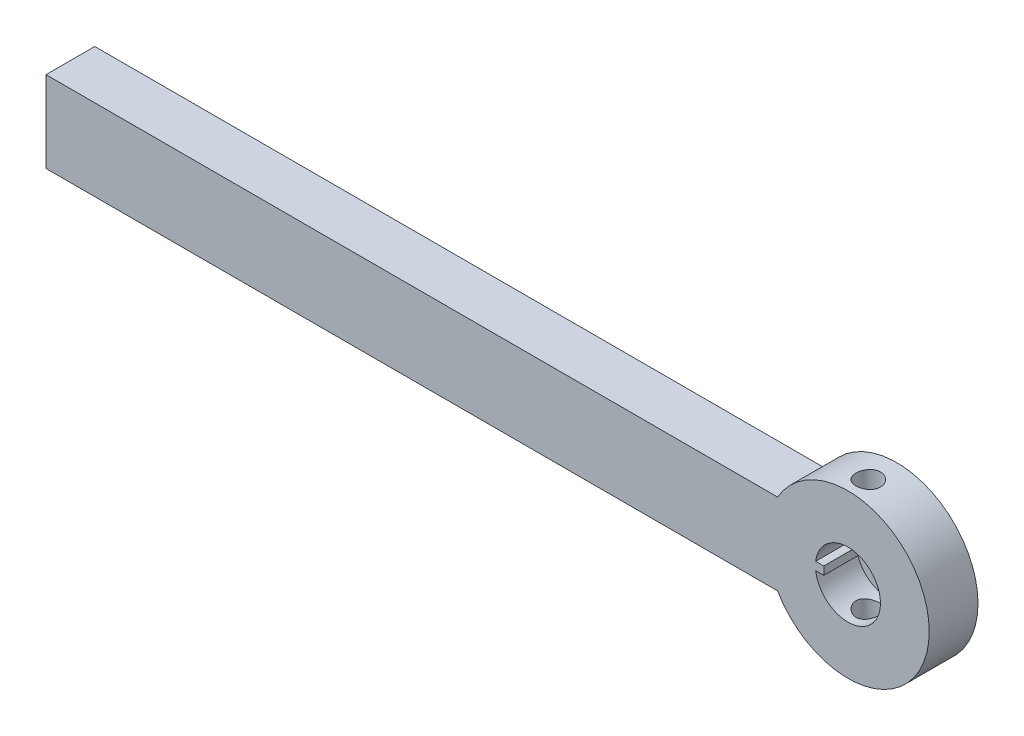
ISO-10303-21;
HEADER;
FILE_DESCRIPTION(('STEP AP214'),'2;1');
FILE_NAME('part.step','',(''),(''),'','','');
FILE_SCHEMA(('AUTOMOTIVE_DESIGN { 1 0 10303 214 1 1 1 1 }'));
ENDSEC;
DATA;
#1=APPLICATION_CONTEXT('core data for automotive mechanical design processes');
#2=APPLICATION_PROTOCOL_DEFINITION('international standard','automotive_design',2000,#1);
#3=PRODUCT_CONTEXT('',#1,'mechanical');
#4=PRODUCT('Part','Part','',(#3));
#5=PRODUCT_RELATED_PRODUCT_CATEGORY('part','',(#4));
#6=PRODUCT_DEFINITION_FORMATION('','',#4);
#7=PRODUCT_DEFINITION_CONTEXT('part definition',#1,'design');
#8=PRODUCT_DEFINITION('design','',#6,#7);
#9=PRODUCT_DEFINITION_SHAPE('','',#8);
#10=(LENGTH_UNIT() NAMED_UNIT(*) SI_UNIT(.MILLI.,.METRE.));
#11=(NAMED_UNIT(*) PLANE_ANGLE_UNIT() SI_UNIT($,.RADIAN.));
#12=(NAMED_UNIT(*) SI_UNIT($,.STERADIAN.) SOLID_ANGLE_UNIT());
#13=UNCERTAINTY_MEASURE_WITH_UNIT(LENGTH_MEASURE(1.E-05),#10,'distance_accuracy_value','');
#14=(GEOMETRIC_REPRESENTATION_CONTEXT(3) GLOBAL_UNCERTAINTY_ASSIGNED_CONTEXT((#13)) GLOBAL_UNIT_ASSIGNED_CONTEXT((#10,
#11,#12)) REPRESENTATION_CONTEXT('',''));
#15=CARTESIAN_POINT('',(0.,0.,0.));
#16=DIRECTION('',(0.,0.,1.));
#17=DIRECTION('',(1.,0.,0.));
#18=AXIS2_PLACEMENT_3D('',#15,#16,#17);
#19=CARTESIAN_POINT('',(-98.6602540378444,5.,6.));
#20=DIRECTION('',(1.,0.,0.));
#21=DIRECTION('',(0.,0.,-1.));
#22=AXIS2_PLACEMENT_3D('',#19,#20,#21);
#23=PLANE('',#22);
#24=DIRECTION('',(0.,-1.,0.));
#25=VECTOR('',#24,1.);
#26=CARTESIAN_POINT('',(-98.6602540378444,5.,0.));
#27=LINE('',#26,#25);
#28=CARTESIAN_POINT('',(-98.6602540378444,5.,0.));
#29=VERTEX_POINT('',#28);
#30=CARTESIAN_POINT('',(-98.6602540378444,-5.,0.));
#31=VERTEX_POINT('',#30);
#32=EDGE_CURVE('E198',#29,#31,#27,.T.);
#33=ORIENTED_EDGE('',*,*,#32,.T.);
#34=DIRECTION('',(0.,0.,-1.));
#35=VECTOR('',#34,1.);
#36=CARTESIAN_POINT('',(-98.6602540378444,-5.,6.));
#37=LINE('',#36,#35);
#38=CARTESIAN_POINT('',(-98.6602540378444,-5.,6.));
#39=VERTEX_POINT('',#38);
#40=EDGE_CURVE('E11',#39,#31,#37,.T.);
#41=ORIENTED_EDGE('',*,*,#40,.F.);
#42=DIRECTION('',(0.,-1.,0.));
#43=VECTOR('',#42,1.);
#44=CARTESIAN_POINT('',(-98.6602540378444,5.,6.));
#45=LINE('',#44,#43);
#46=CARTESIAN_POINT('',(-98.6602540378444,5.,6.));
#47=VERTEX_POINT('',#46);
#48=EDGE_CURVE('E216',#47,#39,#45,.T.);
#49=ORIENTED_EDGE('',*,*,#48,.F.);
#50=DIRECTION('',(0.,0.,-1.));
#51=VECTOR('',#50,1.);
#52=CARTESIAN_POINT('',(-98.6602540378444,5.,6.));
#53=LINE('',#52,#51);
#54=EDGE_CURVE('E201',#47,#29,#53,.T.);
#55=ORIENTED_EDGE('',*,*,#54,.T.);
#56=EDGE_LOOP('',(#33,#41,#49,#55));
#57=FACE_BOUND('',#56,.T.);
#58=ADVANCED_FACE('F32',(#57),#23,.F.);
#59=CARTESIAN_POINT('',(-98.6602540378444,-5.,6.));
#60=DIRECTION('',(0.,1.,0.));
#61=DIRECTION('',(-1.,0.,0.));
#62=AXIS2_PLACEMENT_3D('',#59,#60,#61);
#63=PLANE('',#62);
#64=DIRECTION('',(1.,0.,0.));
#65=VECTOR('',#64,1.);
#66=CARTESIAN_POINT('',(-98.6602540378444,-5.,0.));
#67=LINE('',#66,#65);
#68=CARTESIAN_POINT('',(-8.66025403784439,-5.,0.));
#69=VERTEX_POINT('',#68);
#70=EDGE_CURVE('E203',#31,#69,#67,.T.);
#71=ORIENTED_EDGE('',*,*,#70,.T.);
#72=DIRECTION('',(0.,0.,-1.));
#73=VECTOR('',#72,1.);
#74=CARTESIAN_POINT('',(-8.66025403784439,-5.,6.));
#75=LINE('',#74,#73);
#76=CARTESIAN_POINT('',(-8.66025403784439,-5.,6.));
#77=VERTEX_POINT('',#76);
#78=EDGE_CURVE('E45',#77,#69,#75,.T.);
#79=ORIENTED_EDGE('',*,*,#78,.F.);
#80=DIRECTION('',(1.,0.,0.));
#81=VECTOR('',#80,1.);
#82=CARTESIAN_POINT('',(-98.6602540378444,-5.,6.));
#83=LINE('',#82,#81);
#84=EDGE_CURVE('E229',#39,#77,#83,.T.);
#85=ORIENTED_EDGE('',*,*,#84,.F.);
#86=ORIENTED_EDGE('',*,*,#40,.T.);
#87=EDGE_LOOP('',(#71,#79,#85,#86));
#88=FACE_BOUND('',#87,.T.);
#89=ADVANCED_FACE('F186',(#88),#63,.F.);
#90=CARTESIAN_POINT('',(0.,0.,6.));
#91=DIRECTION('',(0.,0.,-1.));
#92=DIRECTION('',(-1.,0.,0.));
#93=AXIS2_PLACEMENT_3D('',#90,#91,#92);
#94=CYLINDRICAL_SURFACE('',#93,10.);
#95=CARTESIAN_POINT('',(0.,10.,2.));
#96=CARTESIAN_POINT('',(0.0837515444816421,9.99999865771297,2.00000345381524));
#97=CARTESIAN_POINT('',(0.167551685082132,9.9989368253704,2.00703800084063));
#98=CARTESIAN_POINT('',(0.332809627994913,9.99480315973187,2.03498319998275));
#99=CARTESIAN_POINT('',(0.414265068974229,9.99172936938473,2.05590736294489));
#100=CARTESIAN_POINT('',(0.57241808622186,9.98391721219526,2.11099250496762));
#101=CARTESIAN_POINT('',(0.649119207826799,9.97918010370919,2.14514347950595));
#102=CARTESIAN_POINT('',(0.795690428635254,9.96856475911724,2.22568837941686));
#103=CARTESIAN_POINT('',(0.865561474725188,9.96268668152773,2.27208060441736));
#104=CARTESIAN_POINT('',(0.997046719562126,9.95039170991452,2.37617726493987));
#105=CARTESIAN_POINT('',(1.0585998322255,9.94397133890331,2.4339584562082));
#106=CARTESIAN_POINT('',(1.17117490668948,9.93134261133238,2.55902768889387));
#107=CARTESIAN_POINT('',(1.22219626272936,9.92513426698505,2.62631627677852));
#108=CARTESIAN_POINT('',(1.31249729499943,9.91359877458726,2.76890064352249));
#109=CARTESIAN_POINT('',(1.35171787037205,9.90827611975031,2.84423424698134));
#110=CARTESIAN_POINT('',(1.41692632171056,9.89916211306268,3.00051282064543));
#111=CARTESIAN_POINT('',(1.44291491889163,9.89537067775449,3.08145748474389));
#112=CARTESIAN_POINT('',(1.48073198798911,9.88978256218673,3.24601804187171));
#113=CARTESIAN_POINT('',(1.49266503640518,9.8879711574125,3.32960939340802));
#114=CARTESIAN_POINT('',(1.50235624033932,9.88650348970582,3.49762616598728));
#115=CARTESIAN_POINT('',(1.50011520973796,9.88684710303147,3.58205153886249));
#116=CARTESIAN_POINT('',(1.48160733250788,9.88963718352409,3.74860108019414));
#117=CARTESIAN_POINT('',(1.4654569592775,9.89206618761549,3.8307385264848));
#118=CARTESIAN_POINT('',(1.41977117403734,9.89872608126367,3.99112436887153));
#119=CARTESIAN_POINT('',(1.39023538337812,9.90295702179379,4.06937265488074));
#120=CARTESIAN_POINT('',(1.31849603529737,9.91276335545481,4.22011337128286));
#121=CARTESIAN_POINT('',(1.27624314283198,9.91834396766526,4.29258196909239));
#122=CARTESIAN_POINT('',(1.18030413128955,9.93021707574548,4.42944459578193));
#123=CARTESIAN_POINT('',(1.12661726182478,9.93650961832501,4.49383809426937));
#124=CARTESIAN_POINT('',(1.00869493078248,9.94917473056209,4.61339766073972));
#125=CARTESIAN_POINT('',(0.944359329642002,9.95554747112815,4.66846499028634));
#126=CARTESIAN_POINT('',(0.807307089894186,9.96759647648462,4.76703593450726));
#127=CARTESIAN_POINT('',(0.73459041458817,9.9732727382251,4.8105394985439));
#128=CARTESIAN_POINT('',(0.582754598213686,9.98329515585393,4.88475308649955));
#129=CARTESIAN_POINT('',(0.50363167783678,9.98764051925428,4.9154554918403));
#130=CARTESIAN_POINT('',(0.341273182487061,9.99450490557069,4.96310938968537));
#131=CARTESIAN_POINT('',(0.258037885952601,9.99702405195467,4.98006181181558));
#132=CARTESIAN_POINT('',(0.0906695676436467,9.99993581133871,4.9996032298167));
#133=CARTESIAN_POINT('',(0.00655273187047053,10.0003485209039,5.00232797137932));
#134=CARTESIAN_POINT('',(-0.160936677662283,9.99905561015226,4.99369699468898));
#135=CARTESIAN_POINT('',(-0.244309274381877,9.99735005541369,4.9823417123319));
#136=CARTESIAN_POINT('',(-0.407532387431408,9.99202468615333,4.94598589982246));
#137=CARTESIAN_POINT('',(-0.487397963079838,9.98841415207984,4.92105150396915));
#138=CARTESIAN_POINT('',(-0.641814958642999,9.97968235658369,4.85831500253824));
#139=CARTESIAN_POINT('',(-0.7163661287951,9.97456102421565,4.82051229266637));
#140=CARTESIAN_POINT('',(-0.858634979291921,9.96332682468686,4.73279377543614));
#141=CARTESIAN_POINT('',(-0.926299009891566,9.95720701626745,4.68279185998723));
#142=CARTESIAN_POINT('',(-1.05232367317771,9.94467863012165,4.57221418837126));
#143=CARTESIAN_POINT('',(-1.1106837647934,9.93827003562867,4.51163781767535));
#144=CARTESIAN_POINT('',(-1.21693784957195,9.92582264304494,4.38102646682351));
#145=CARTESIAN_POINT('',(-1.26474084747421,9.91978736017588,4.31091707480523));
#146=CARTESIAN_POINT('',(-1.34789129270584,9.90883219104903,4.16358395948823));
#147=CARTESIAN_POINT('',(-1.38323907656436,9.90391227465628,4.08636042847854));
#148=CARTESIAN_POINT('',(-1.44033467323943,9.89577033008645,3.92726246637687));
#149=CARTESIAN_POINT('',(-1.46213037141635,9.89254233006438,3.84540553902876));
#150=CARTESIAN_POINT('',(-1.49165549501586,9.88813382297802,3.67914098456489));
#151=CARTESIAN_POINT('',(-1.49938589183067,9.88695317451771,3.59473353400533));
#152=CARTESIAN_POINT('',(-1.5005378666944,9.88677832610841,3.42667093668422));
#153=CARTESIAN_POINT('',(-1.49410252167313,9.88776226333502,3.34301675824308));
#154=CARTESIAN_POINT('',(-1.46741229544379,9.89175820611174,3.17799473667648));
#155=CARTESIAN_POINT('',(-1.44715743638627,9.89477020841118,3.09662688988661));
#156=CARTESIAN_POINT('',(-1.39345373518665,9.90247526112297,2.93852691776568));
#157=CARTESIAN_POINT('',(-1.36001489324314,9.90716703716075,2.86179132956656));
#158=CARTESIAN_POINT('',(-1.28090667642309,9.91770454557702,2.7149963661976));
#159=CARTESIAN_POINT('',(-1.23523688741502,9.92355031702724,2.64493721719636));
#160=CARTESIAN_POINT('',(-1.13244337659164,9.93580743364938,2.51275694202483));
#161=CARTESIAN_POINT('',(-1.07521369039806,9.94222367881967,2.45071866675294));
#162=CARTESIAN_POINT('',(-0.951148841082836,9.95485788826636,2.33707544521218));
#163=CARTESIAN_POINT('',(-0.884311448350942,9.96107580610759,2.28547292742384));
#164=CARTESIAN_POINT('',(-0.742495707543723,9.9726518579052,2.19391232339264));
#165=CARTESIAN_POINT('',(-0.667474576764762,9.9780050712882,2.15401989078525));
#166=CARTESIAN_POINT('',(-0.51175187024872,9.98720028802959,2.08746148324196));
#167=CARTESIAN_POINT('',(-0.431056277096705,9.99104385565757,2.06078180994631));
#168=CARTESIAN_POINT('',(-0.29166572788933,9.99590939261505,2.02745865728989));
#169=CARTESIAN_POINT('',(-0.233831133495279,9.99743549179557,2.01717739846119));
#170=CARTESIAN_POINT('',(-0.117338971600126,9.99948125947896,2.00344690228736));
#171=CARTESIAN_POINT('',(-0.0586814143344173,10.0000009404877,1.99999758004745));
#172=CARTESIAN_POINT('',(0.,10.,2.));
#173=B_SPLINE_CURVE_WITH_KNOTS('',3,(#95,#96,#97,#98,#99,#100,#101,#102,#103,#104,#105,#106,
#107,#108,#109,#110,#111,#112,#113,#114,#115,#116,#117,#118,#119,#120,#121,#122,#123,#124,#125,
#126,#127,#128,#129,#130,#131,#132,#133,#134,#135,#136,#137,#138,#139,#140,#141,#142,#143,#144,
#145,#146,#147,#148,#149,#150,#151,#152,#153,#154,#155,#156,#157,#158,#159,#160,#161,#162,#163,
#164,#165,#166,#167,#168,#169,#170,#171,#172),.UNSPECIFIED.,.T.,.F.,(4,2,2,2,2,2,2,2,2,2,2,2,2,
2,2,2,2,2,2,2,2,2,2,2,2,2,2,2,2,2,2,2,2,2,2,2,2,2,4),(0.,0.251040205031663,0.50232496292915,
0.753420023583237,1.0044802241976,1.25729416136843,1.5101226357258,1.76419702395375,
2.01825756225506,2.27041564605924,2.52255925098982,2.77261177195746,3.02267136690361,
3.27371383476159,3.52477278308534,3.77834291255409,4.03191415238668,4.28563608984874,
4.53934087193401,4.79062058544255,5.04189251991155,5.29195148965948,5.54202220376273,
5.79391188036908,6.0458162002863,6.29981366584672,6.55380426808832,6.80689223457168,
7.05996272137176,7.31048888261064,7.56101464229564,7.81135073984146,8.06169531466879,
8.3144482996572,8.56726003468733,8.82146323384733,9.07540233261441,9.25129851978808,
9.42719252123291),.UNSPECIFIED.);
#174=CARTESIAN_POINT('',(0.,10.,2.));
#175=VERTEX_POINT('',#174);
#176=EDGE_CURVE('E137',#175,#175,#173,.T.);
#177=ORIENTED_EDGE('',*,*,#176,.T.);
#178=EDGE_LOOP('',(#177));
#179=FACE_BOUND('',#178,.T.);
#180=CARTESIAN_POINT('',(0.,-10.,2.));
#181=CARTESIAN_POINT('',(-0.0837515444816421,-9.99999865771297,2.00000345381524));
#182=CARTESIAN_POINT('',(-0.167551685082132,-9.9989368253704,2.00703800084063));
#183=CARTESIAN_POINT('',(-0.332809627994913,-9.99480315973187,2.03498319998275));
#184=CARTESIAN_POINT('',(-0.414265068974229,-9.99172936938473,2.05590736294489));
#185=CARTESIAN_POINT('',(-0.57241808622186,-9.98391721219526,2.11099250496762));
#186=CARTESIAN_POINT('',(-0.649119207826799,-9.97918010370919,2.14514347950595));
#187=CARTESIAN_POINT('',(-0.795690428635254,-9.96856475911724,2.22568837941686));
#188=CARTESIAN_POINT('',(-0.865561474725188,-9.96268668152773,2.27208060441736));
#189=CARTESIAN_POINT('',(-0.997046719562126,-9.95039170991452,2.37617726493987));
#190=CARTESIAN_POINT('',(-1.0585998322255,-9.94397133890331,2.4339584562082));
#191=CARTESIAN_POINT('',(-1.17117490668948,-9.93134261133238,2.55902768889387));
#192=CARTESIAN_POINT('',(-1.22219626272936,-9.92513426698505,2.62631627677852));
#193=CARTESIAN_POINT('',(-1.31249729499943,-9.91359877458726,2.76890064352249));
#194=CARTESIAN_POINT('',(-1.35171787037205,-9.90827611975031,2.84423424698134));
#195=CARTESIAN_POINT('',(-1.41692632171056,-9.89916211306268,3.00051282064543));
#196=CARTESIAN_POINT('',(-1.44291491889163,-9.89537067775449,3.08145748474389));
#197=CARTESIAN_POINT('',(-1.48073198798911,-9.88978256218673,3.24601804187171));
#198=CARTESIAN_POINT('',(-1.49266503640518,-9.8879711574125,3.32960939340802));
#199=CARTESIAN_POINT('',(-1.50235624033932,-9.88650348970582,3.49762616598728));
#200=CARTESIAN_POINT('',(-1.50011520973796,-9.88684710303147,3.58205153886249));
#201=CARTESIAN_POINT('',(-1.48160733250788,-9.88963718352409,3.74860108019414));
#202=CARTESIAN_POINT('',(-1.4654569592775,-9.89206618761549,3.8307385264848));
#203=CARTESIAN_POINT('',(-1.41977117403734,-9.89872608126367,3.99112436887153));
#204=CARTESIAN_POINT('',(-1.39023538337812,-9.90295702179379,4.06937265488074));
#205=CARTESIAN_POINT('',(-1.31849603529737,-9.91276335545481,4.22011337128286));
#206=CARTESIAN_POINT('',(-1.27624314283198,-9.91834396766526,4.29258196909239));
#207=CARTESIAN_POINT('',(-1.18030413128955,-9.93021707574548,4.42944459578193));
#208=CARTESIAN_POINT('',(-1.12661726182478,-9.93650961832501,4.49383809426937));
#209=CARTESIAN_POINT('',(-1.00869493078248,-9.94917473056209,4.61339766073972));
#210=CARTESIAN_POINT('',(-0.944359329642002,-9.95554747112815,4.66846499028634));
#211=CARTESIAN_POINT('',(-0.807307089894186,-9.96759647648462,4.76703593450726));
#212=CARTESIAN_POINT('',(-0.73459041458817,-9.9732727382251,4.8105394985439));
#213=CARTESIAN_POINT('',(-0.582754598213686,-9.98329515585393,4.88475308649955));
#214=CARTESIAN_POINT('',(-0.50363167783678,-9.98764051925428,4.9154554918403));
#215=CARTESIAN_POINT('',(-0.341273182487061,-9.99450490557069,4.96310938968537));
#216=CARTESIAN_POINT('',(-0.258037885952601,-9.99702405195467,4.98006181181558));
#217=CARTESIAN_POINT('',(-0.0906695676436467,-9.99993581133871,4.9996032298167));
#218=CARTESIAN_POINT('',(-0.00655273187047053,-10.0003485209039,5.00232797137932));
#219=CARTESIAN_POINT('',(0.160936677662283,-9.99905561015226,4.99369699468898));
#220=CARTESIAN_POINT('',(0.244309274381877,-9.99735005541369,4.9823417123319));
#221=CARTESIAN_POINT('',(0.407532387431408,-9.99202468615333,4.94598589982246));
#222=CARTESIAN_POINT('',(0.487397963079838,-9.98841415207984,4.92105150396915));
#223=CARTESIAN_POINT('',(0.641814958642999,-9.97968235658369,4.85831500253824));
#224=CARTESIAN_POINT('',(0.7163661287951,-9.97456102421565,4.82051229266637));
#225=CARTESIAN_POINT('',(0.858634979291921,-9.96332682468686,4.73279377543614));
#226=CARTESIAN_POINT('',(0.926299009891566,-9.95720701626745,4.68279185998723));
#227=CARTESIAN_POINT('',(1.05232367317771,-9.94467863012165,4.57221418837126));
#228=CARTESIAN_POINT('',(1.1106837647934,-9.93827003562867,4.51163781767535));
#229=CARTESIAN_POINT('',(1.21693784957195,-9.92582264304494,4.38102646682351));
#230=CARTESIAN_POINT('',(1.26474084747421,-9.91978736017588,4.31091707480523));
#231=CARTESIAN_POINT('',(1.34789129270584,-9.90883219104903,4.16358395948823));
#232=CARTESIAN_POINT('',(1.38323907656436,-9.90391227465628,4.08636042847854));
#233=CARTESIAN_POINT('',(1.44033467323943,-9.89577033008645,3.92726246637687));
#234=CARTESIAN_POINT('',(1.46213037141635,-9.89254233006438,3.84540553902876));
#235=CARTESIAN_POINT('',(1.49165549501586,-9.88813382297802,3.67914098456489));
#236=CARTESIAN_POINT('',(1.49938589183067,-9.88695317451771,3.59473353400533));
#237=CARTESIAN_POINT('',(1.5005378666944,-9.88677832610841,3.42667093668422));
#238=CARTESIAN_POINT('',(1.49410252167313,-9.88776226333502,3.34301675824308));
#239=CARTESIAN_POINT('',(1.46741229544379,-9.89175820611174,3.17799473667648));
#240=CARTESIAN_POINT('',(1.44715743638627,-9.89477020841118,3.09662688988661));
#241=CARTESIAN_POINT('',(1.39345373518665,-9.90247526112297,2.93852691776568));
#242=CARTESIAN_POINT('',(1.36001489324314,-9.90716703716075,2.86179132956656));
#243=CARTESIAN_POINT('',(1.28090667642309,-9.91770454557702,2.7149963661976));
#244=CARTESIAN_POINT('',(1.23523688741502,-9.92355031702724,2.64493721719636));
#245=CARTESIAN_POINT('',(1.13244337659164,-9.93580743364938,2.51275694202483));
#246=CARTESIAN_POINT('',(1.07521369039806,-9.94222367881967,2.45071866675294));
#247=CARTESIAN_POINT('',(0.951148841082836,-9.95485788826636,2.33707544521218));
#248=CARTESIAN_POINT('',(0.884311448350942,-9.96107580610759,2.28547292742384));
#249=CARTESIAN_POINT('',(0.742495707543723,-9.9726518579052,2.19391232339264));
#250=CARTESIAN_POINT('',(0.667474576764762,-9.9780050712882,2.15401989078525));
#251=CARTESIAN_POINT('',(0.51175187024872,-9.98720028802959,2.08746148324196));
#252=CARTESIAN_POINT('',(0.431056277096705,-9.99104385565757,2.06078180994631));
#253=CARTESIAN_POINT('',(0.29166572788933,-9.99590939261505,2.02745865728989));
#254=CARTESIAN_POINT('',(0.233831133495279,-9.99743549179557,2.01717739846119));
#255=CARTESIAN_POINT('',(0.117338971600126,-9.99948125947896,2.00344690228736));
#256=CARTESIAN_POINT('',(0.0586814143344173,-10.0000009404877,1.99999758004745));
#257=CARTESIAN_POINT('',(0.,-10.,2.));
#258=B_SPLINE_CURVE_WITH_KNOTS('',3,(#180,#181,#182,#183,#184,#185,#186,#187,#188,#189,#190,
#191,#192,#193,#194,#195,#196,#197,#198,#199,#200,#201,#202,#203,#204,#205,#206,#207,#208,#209,
#210,#211,#212,#213,#214,#215,#216,#217,#218,#219,#220,#221,#222,#223,#224,#225,#226,#227,#228,
#229,#230,#231,#232,#233,#234,#235,#236,#237,#238,#239,#240,#241,#242,#243,#244,#245,#246,#247,
#248,#249,#250,#251,#252,#253,#254,#255,#256,#257),.UNSPECIFIED.,.T.,.F.,(4,2,2,2,2,2,2,2,2,2,2,
2,2,2,2,2,2,2,2,2,2,2,2,2,2,2,2,2,2,2,2,2,2,2,2,2,2,2,4),(0.,0.251040205031663,0.50232496292915,
0.753420023583237,1.0044802241976,1.25729416136843,1.5101226357258,1.76419702395375,
2.01825756225506,2.27041564605924,2.52255925098982,2.77261177195746,3.02267136690361,
3.27371383476159,3.52477278308534,3.77834291255409,4.03191415238668,4.28563608984874,
4.53934087193401,4.79062058544255,5.04189251991155,5.29195148965948,5.54202220376273,
5.79391188036908,6.0458162002863,6.29981366584672,6.55380426808832,6.80689223457168,
7.05996272137176,7.31048888261064,7.56101464229564,7.81135073984146,8.06169531466879,
8.3144482996572,8.56726003468733,8.82146323384733,9.07540233261441,9.25129851978808,
9.42719252123291),.UNSPECIFIED.);
#259=CARTESIAN_POINT('',(0.,-10.,2.));
#260=VERTEX_POINT('',#259);
#261=EDGE_CURVE('E144',#260,#260,#258,.T.);
#262=ORIENTED_EDGE('',*,*,#261,.T.);
#263=EDGE_LOOP('',(#262));
#264=FACE_BOUND('',#263,.T.);
#265=CARTESIAN_POINT('',(0.,0.,0.));
#266=DIRECTION('',(0.,0.,1.));
#267=DIRECTION('',(1.,0.,0.));
#268=AXIS2_PLACEMENT_3D('',#265,#266,#267);
#269=CIRCLE('',#268,10.);
#270=CARTESIAN_POINT('',(-8.66025403784439,5.,0.));
#271=VERTEX_POINT('',#270);
#272=EDGE_CURVE('E206',#69,#271,#269,.T.);
#273=ORIENTED_EDGE('',*,*,#272,.T.);
#274=DIRECTION('',(0.,0.,-1.));
#275=VECTOR('',#274,1.);
#276=CARTESIAN_POINT('',(-8.66025403784439,5.,6.));
#277=LINE('',#276,#275);
#278=CARTESIAN_POINT('',(-8.66025403784439,5.,6.));
#279=VERTEX_POINT('',#278);
#280=EDGE_CURVE('E218',#279,#271,#277,.T.);
#281=ORIENTED_EDGE('',*,*,#280,.F.);
#282=CARTESIAN_POINT('',(0.,0.,6.));
#283=DIRECTION('',(0.,0.,1.));
#284=DIRECTION('',(1.,0.,0.));
#285=AXIS2_PLACEMENT_3D('',#282,#283,#284);
#286=CIRCLE('',#285,10.);
#287=EDGE_CURVE('E226',#77,#279,#286,.T.);
#288=ORIENTED_EDGE('',*,*,#287,.F.);
#289=ORIENTED_EDGE('',*,*,#78,.T.);
#290=EDGE_LOOP('',(#273,#281,#288,#289));
#291=FACE_BOUND('',#290,.T.);
#292=ADVANCED_FACE('F149',(#179,#264,#291),#94,.T.);
#293=CARTESIAN_POINT('',(-98.6602540378444,5.,6.));
#294=DIRECTION('',(0.,-1.,0.));
#295=DIRECTION('',(0.,0.,-1.));
#296=AXIS2_PLACEMENT_3D('',#293,#294,#295);
#297=PLANE('',#296);
#298=DIRECTION('',(-1.,0.,0.));
#299=VECTOR('',#298,1.);
#300=CARTESIAN_POINT('',(-98.6602540378444,5.,0.));
#301=LINE('',#300,#299);
#302=EDGE_CURVE('E214',#271,#29,#301,.T.);
#303=ORIENTED_EDGE('',*,*,#302,.T.);
#304=ORIENTED_EDGE('',*,*,#54,.F.);
#305=DIRECTION('',(-1.,0.,0.));
#306=VECTOR('',#305,1.);
#307=CARTESIAN_POINT('',(-98.6602540378444,5.,6.));
#308=LINE('',#307,#306);
#309=EDGE_CURVE('E210',#279,#47,#308,.T.);
#310=ORIENTED_EDGE('',*,*,#309,.F.);
#311=ORIENTED_EDGE('',*,*,#280,.T.);
#312=EDGE_LOOP('',(#303,#304,#310,#311));
#313=FACE_BOUND('',#312,.T.);
#314=ADVANCED_FACE('F178',(#313),#297,.F.);
#315=CARTESIAN_POINT('',(0.,0.,6.));
#316=DIRECTION('',(0.,0.,1.));
#317=DIRECTION('',(1.,0.,0.));
#318=AXIS2_PLACEMENT_3D('',#315,#316,#317);
#319=PLANE('',#318);
#320=CARTESIAN_POINT('',(0.,0.,6.));
#321=DIRECTION('',(0.,0.,1.));
#322=DIRECTION('',(1.,0.,0.));
#323=AXIS2_PLACEMENT_3D('',#320,#321,#322);
#324=CIRCLE('',#323,4.);
#325=CARTESIAN_POINT('',(-3.96862696659689,-0.5,6.));
#326=VERTEX_POINT('',#325);
#327=CARTESIAN_POINT('',(-3.96862696659689,0.5,6.));
#328=VERTEX_POINT('',#327);
#329=EDGE_CURVE('E57',#326,#328,#324,.T.);
#330=ORIENTED_EDGE('',*,*,#329,.F.);
#331=DIRECTION('',(1.,0.,0.));
#332=VECTOR('',#331,1.);
#333=CARTESIAN_POINT('',(-2.96862696659689,-0.5,6.));
#334=LINE('',#333,#332);
#335=CARTESIAN_POINT('',(-2.96862696659689,-0.5,6.));
#336=VERTEX_POINT('',#335);
#337=EDGE_CURVE('E107',#326,#336,#334,.T.);
#338=ORIENTED_EDGE('',*,*,#337,.T.);
#339=DIRECTION('',(0.,1.,0.));
#340=VECTOR('',#339,1.);
#341=CARTESIAN_POINT('',(-2.96862696659689,0.5,6.));
#342=LINE('',#341,#340);
#343=CARTESIAN_POINT('',(-2.96862696659689,0.5,6.));
#344=VERTEX_POINT('',#343);
#345=EDGE_CURVE('E114',#336,#344,#342,.T.);
#346=ORIENTED_EDGE('',*,*,#345,.T.);
#347=DIRECTION('',(-1.,0.,0.));
#348=VECTOR('',#347,1.);
#349=CARTESIAN_POINT('',(-3.96862696659689,0.5,6.));
#350=LINE('',#349,#348);
#351=EDGE_CURVE('E120',#344,#328,#350,.T.);
#352=ORIENTED_EDGE('',*,*,#351,.T.);
#353=EDGE_LOOP('',(#330,#338,#346,#352));
#354=FACE_BOUND('',#353,.T.);
#355=ORIENTED_EDGE('',*,*,#48,.T.);
#356=ORIENTED_EDGE('',*,*,#84,.T.);
#357=ORIENTED_EDGE('',*,*,#287,.T.);
#358=ORIENTED_EDGE('',*,*,#309,.T.);
#359=EDGE_LOOP('',(#355,#356,#357,#358));
#360=FACE_BOUND('',#359,.T.);
#361=ADVANCED_FACE('F122',(#354,#360),#319,.T.);
#362=CARTESIAN_POINT('',(0.,0.,0.));
#363=DIRECTION('',(0.,0.,1.));
#364=DIRECTION('',(1.,0.,0.));
#365=AXIS2_PLACEMENT_3D('',#362,#363,#364);
#366=PLANE('',#365);
#367=ORIENTED_EDGE('',*,*,#32,.F.);
#368=ORIENTED_EDGE('',*,*,#302,.F.);
#369=ORIENTED_EDGE('',*,*,#272,.F.);
#370=ORIENTED_EDGE('',*,*,#70,.F.);
#371=EDGE_LOOP('',(#367,#368,#369,#370));
#372=FACE_BOUND('',#371,.T.);
#373=ADVANCED_FACE('F173',(#372),#366,.F.);
#374=CARTESIAN_POINT('',(0.,0.,1.));
#375=DIRECTION('',(0.,0.,1.));
#376=DIRECTION('',(1.,0.,0.));
#377=AXIS2_PLACEMENT_3D('',#374,#375,#376);
#378=CYLINDRICAL_SURFACE('',#377,4.);
#379=CARTESIAN_POINT('',(0.,4.,2.));
#380=CARTESIAN_POINT('',(-0.0812350589378529,4.00000217456151,1.99999709769689));
#381=CARTESIAN_POINT('',(-0.162450241781792,3.99750379283184,2.00661976024838));
#382=CARTESIAN_POINT('',(-0.322453452352361,3.98778696006928,2.03282819526993));
#383=CARTESIAN_POINT('',(-0.401241827987616,3.98056918893993,2.05241210047057));
#384=CARTESIAN_POINT('',(-0.554060784990879,3.96218832391545,2.10375300177176));
#385=CARTESIAN_POINT('',(-0.628100224162277,3.9510328434944,2.13548651682179));
#386=CARTESIAN_POINT('',(-0.769799310160254,3.92588767765353,2.21010641301582));
#387=CARTESIAN_POINT('',(-0.837457239177879,3.91189723227548,2.25299578554416));
#388=CARTESIAN_POINT('',(-0.967346417045826,3.88186246971217,2.35061253107091));
#389=CARTESIAN_POINT('',(-1.02927073015119,3.86576002583566,2.4057302622594));
#390=CARTESIAN_POINT('',(-1.14324421474363,3.83360220871327,2.52541043465884));
#391=CARTESIAN_POINT('',(-1.19529036359203,3.81754685135033,2.58997575608787));
#392=CARTESIAN_POINT('',(-1.28998202215985,3.78662470617731,2.72971746752321));
#393=CARTESIAN_POINT('',(-1.3321939319576,3.77182648820818,2.80520436654582));
#394=CARTESIAN_POINT('',(-1.40318646334084,3.74599860237433,2.96284835416852));
#395=CARTESIAN_POINT('',(-1.43197244961239,3.73496742975881,3.0450027631551));
#396=CARTESIAN_POINT('',(-1.47408431017549,3.71854412824136,3.2101167402582));
#397=CARTESIAN_POINT('',(-1.48799593218558,3.71293924350838,3.29290503843544));
#398=CARTESIAN_POINT('',(-1.50179556531648,3.70738061461215,3.45981615799384));
#399=CARTESIAN_POINT('',(-1.50168936802631,3.70742453659305,3.54393841387447));
#400=CARTESIAN_POINT('',(-1.48790429610018,3.71297511632055,3.70576952521296));
#401=CARTESIAN_POINT('',(-1.47503808509003,3.71815468871122,3.78356090604418));
#402=CARTESIAN_POINT('',(-1.4374416786833,3.73284938059529,3.93578715040532));
#403=CARTESIAN_POINT('',(-1.41270969663258,3.74236515298863,4.01022150661388));
#404=CARTESIAN_POINT('',(-1.35163748571904,3.76485702190253,4.15527706772823));
#405=CARTESIAN_POINT('',(-1.31508648737101,3.77789517988166,4.2257994861213));
#406=CARTESIAN_POINT('',(-1.23156073762698,3.80594210139319,4.35994573759097));
#407=CARTESIAN_POINT('',(-1.18458238728897,3.82095154457158,4.4235671775197));
#408=CARTESIAN_POINT('',(-1.07781780766549,3.85248038859113,4.54660366365088));
#409=CARTESIAN_POINT('',(-1.01738298716956,3.86903347455671,4.60544864074809));
#410=CARTESIAN_POINT('',(-0.887312590819021,3.90091728164085,4.7123379662058));
#411=CARTESIAN_POINT('',(-0.817675603497364,3.91624781465952,4.76038065460567));
#412=CARTESIAN_POINT('',(-0.669723436992419,3.9442639480908,4.84493039706252));
#413=CARTESIAN_POINT('',(-0.591290713844719,3.95690498259616,4.88124758122106));
#414=CARTESIAN_POINT('',(-0.428836850524583,3.97778718326962,4.93998260427004));
#415=CARTESIAN_POINT('',(-0.344818210845767,3.98603030341493,4.96240661656112));
#416=CARTESIAN_POINT('',(-0.178375243148665,3.99684443228065,4.99162278754194));
#417=CARTESIAN_POINT('',(-0.0961036195622095,3.99969369025686,4.99918260638251));
#418=CARTESIAN_POINT('',(0.0685724752550241,4.00025893700126,5.00069106389992));
#419=CARTESIAN_POINT('',(0.150976912983373,3.99797606386863,4.99464272031678));
#420=CARTESIAN_POINT('',(0.310262048561859,3.98871709772643,4.96968995769133));
#421=CARTESIAN_POINT('',(0.387233328007336,3.98192470962305,4.95128845626291));
#422=CARTESIAN_POINT('',(0.536941754957221,3.96451477091717,4.90281392745268));
#423=CARTESIAN_POINT('',(0.609678350347534,3.9538967228203,4.87273938205196));
#424=CARTESIAN_POINT('',(0.751247765110155,3.92949624407681,4.80081358756053));
#425=CARTESIAN_POINT('',(0.819903083557795,3.91563000209348,4.75864227077661));
#426=CARTESIAN_POINT('',(0.949392711726625,3.88626671564664,4.66408189682844));
#427=CARTESIAN_POINT('',(1.01022412027045,3.87076907009516,4.61168906745485));
#428=CARTESIAN_POINT('',(1.12603079874454,3.8387332949099,4.49459587787573));
#429=CARTESIAN_POINT('',(1.18046154123568,3.82218696503729,4.4293578172273));
#430=CARTESIAN_POINT('',(1.27771050031903,3.79078815746854,4.29034861529234));
#431=CARTESIAN_POINT('',(1.32052767414518,3.77593583194399,4.2165767086115));
#432=CARTESIAN_POINT('',(1.39337773518998,3.74966829822463,4.06198401322769));
#433=CARTESIAN_POINT('',(1.42335685446918,3.73826760328493,3.98113525408956));
#434=CARTESIAN_POINT('',(1.46907883466889,3.72054032891005,3.81499023631218));
#435=CARTESIAN_POINT('',(1.48483050305535,3.71421061057491,3.72969676380188));
#436=CARTESIAN_POINT('',(1.50086347097839,3.70775894792573,3.56298384045889));
#437=CARTESIAN_POINT('',(1.50207331495837,3.70726444523341,3.48166736828311));
#438=CARTESIAN_POINT('',(1.49136715641593,3.71158412745292,3.32005468372384));
#439=CARTESIAN_POINT('',(1.47945239850124,3.71639780898899,3.23975837532842));
#440=CARTESIAN_POINT('',(1.44355815630242,3.73048141585432,3.08495277328345));
#441=CARTESIAN_POINT('',(1.41995798316524,3.73961085376663,3.01034165375466));
#442=CARTESIAN_POINT('',(1.3616969677992,3.76121548297845,2.86609449150558));
#443=CARTESIAN_POINT('',(1.32703332944945,3.77369151995215,2.79645971192986));
#444=CARTESIAN_POINT('',(1.24552075938154,3.80139723903965,2.66017321030237));
#445=CARTESIAN_POINT('',(1.1981283280301,3.81673698440964,2.59386920320009));
#446=CARTESIAN_POINT('',(1.09334485729906,3.84806246757177,2.4698584390288));
#447=CARTESIAN_POINT('',(1.03595064012808,3.86404840943145,2.41215442521325));
#448=CARTESIAN_POINT('',(0.909080396784623,3.89590424609881,2.30379804417816));
#449=CARTESIAN_POINT('',(0.839118644212992,3.91172104900645,2.25369624656533));
#450=CARTESIAN_POINT('',(0.691213223200821,3.94054514457031,2.16597734472344));
#451=CARTESIAN_POINT('',(0.613268934090622,3.95355221851559,2.12836121226363));
#452=CARTESIAN_POINT('',(0.447999082002312,3.9757429260668,2.06562317095167));
#453=CARTESIAN_POINT('',(0.360413422234208,3.98473657158356,2.0411129353981));
#454=CARTESIAN_POINT('',(0.181875733606382,3.99686242179587,2.00830704007932));
#455=CARTESIAN_POINT('',(0.090925416364859,3.99999756603967,2.00000324851268));
#456=CARTESIAN_POINT('',(0.,4.,2.));
#457=B_SPLINE_CURVE_WITH_KNOTS('',3,(#379,#380,#381,#382,#383,#384,#385,#386,#387,#388,#389,
#390,#391,#392,#393,#394,#395,#396,#397,#398,#399,#400,#401,#402,#403,#404,#405,#406,#407,#408,
#409,#410,#411,#412,#413,#414,#415,#416,#417,#418,#419,#420,#421,#422,#423,#424,#425,#426,#427,
#428,#429,#430,#431,#432,#433,#434,#435,#436,#437,#438,#439,#440,#441,#442,#443,#444,#445,#446,
#447,#448,#449,#450,#451,#452,#453,#454,#455,#456),.UNSPECIFIED.,.T.,.F.,(4,2,2,2,2,2,2,2,2,2,2,
2,2,2,2,2,2,2,2,2,2,2,2,2,2,2,2,2,2,2,2,2,2,2,2,2,2,2,4),(0.,0.24336980156056,0.486704549530461,
0.729571369213573,0.97250337960949,1.22473618582715,1.47704604925622,1.73896674501659,
2.00078269352134,2.25185874416901,2.50283106079707,2.73878345119971,2.97477138060589,
3.21522408387018,3.45575990744258,3.71246153335813,3.96920257905066,4.22991375286075,
4.49050899698846,4.73725019635925,4.98393668390521,5.2211443792384,5.45838293254454,
5.702592218596,5.94689180019868,6.20536519455658,6.46386178920141,6.72343066727204,
6.98283874956507,7.22558763480252,7.46831350211259,7.70363142426533,7.93900886656506,
8.18672471884271,8.43451941997062,8.69572329654039,8.95694749805102,9.22948515032042,
9.50188601796128),.UNSPECIFIED.);
#458=CARTESIAN_POINT('',(0.,4.,2.));
#459=VERTEX_POINT('',#458);
#460=EDGE_CURVE('E35',#459,#459,#457,.T.);
#461=ORIENTED_EDGE('',*,*,#460,.T.);
#462=EDGE_LOOP('',(#461));
#463=FACE_BOUND('',#462,.T.);
#464=CARTESIAN_POINT('',(0.,-4.,2.));
#465=CARTESIAN_POINT('',(0.0812350589378529,-4.00000217456151,1.99999709769689));
#466=CARTESIAN_POINT('',(0.162450241781792,-3.99750379283184,2.00661976024838));
#467=CARTESIAN_POINT('',(0.322453452352361,-3.98778696006928,2.03282819526993));
#468=CARTESIAN_POINT('',(0.401241827987616,-3.98056918893993,2.05241210047057));
#469=CARTESIAN_POINT('',(0.554060784990879,-3.96218832391545,2.10375300177176));
#470=CARTESIAN_POINT('',(0.628100224162277,-3.9510328434944,2.13548651682179));
#471=CARTESIAN_POINT('',(0.769799310160254,-3.92588767765353,2.21010641301582));
#472=CARTESIAN_POINT('',(0.837457239177879,-3.91189723227548,2.25299578554416));
#473=CARTESIAN_POINT('',(0.967346417045826,-3.88186246971217,2.35061253107091));
#474=CARTESIAN_POINT('',(1.02927073015119,-3.86576002583566,2.4057302622594));
#475=CARTESIAN_POINT('',(1.14324421474363,-3.83360220871327,2.52541043465884));
#476=CARTESIAN_POINT('',(1.19529036359203,-3.81754685135033,2.58997575608787));
#477=CARTESIAN_POINT('',(1.28998202215985,-3.78662470617731,2.72971746752321));
#478=CARTESIAN_POINT('',(1.3321939319576,-3.77182648820818,2.80520436654582));
#479=CARTESIAN_POINT('',(1.40318646334084,-3.74599860237433,2.96284835416852));
#480=CARTESIAN_POINT('',(1.43197244961239,-3.73496742975881,3.0450027631551));
#481=CARTESIAN_POINT('',(1.47408431017549,-3.71854412824136,3.2101167402582));
#482=CARTESIAN_POINT('',(1.48799593218558,-3.71293924350838,3.29290503843544));
#483=CARTESIAN_POINT('',(1.50179556531648,-3.70738061461215,3.45981615799384));
#484=CARTESIAN_POINT('',(1.50168936802631,-3.70742453659305,3.54393841387447));
#485=CARTESIAN_POINT('',(1.48790429610018,-3.71297511632055,3.70576952521296));
#486=CARTESIAN_POINT('',(1.47503808509003,-3.71815468871122,3.78356090604418));
#487=CARTESIAN_POINT('',(1.4374416786833,-3.73284938059529,3.93578715040532));
#488=CARTESIAN_POINT('',(1.41270969663258,-3.74236515298863,4.01022150661388));
#489=CARTESIAN_POINT('',(1.35163748571904,-3.76485702190253,4.15527706772823));
#490=CARTESIAN_POINT('',(1.31508648737101,-3.77789517988166,4.2257994861213));
#491=CARTESIAN_POINT('',(1.23156073762698,-3.80594210139319,4.35994573759097));
#492=CARTESIAN_POINT('',(1.18458238728897,-3.82095154457158,4.4235671775197));
#493=CARTESIAN_POINT('',(1.07781780766549,-3.85248038859113,4.54660366365088));
#494=CARTESIAN_POINT('',(1.01738298716956,-3.86903347455671,4.60544864074809));
#495=CARTESIAN_POINT('',(0.887312590819021,-3.90091728164085,4.7123379662058));
#496=CARTESIAN_POINT('',(0.817675603497364,-3.91624781465952,4.76038065460567));
#497=CARTESIAN_POINT('',(0.669723436992419,-3.9442639480908,4.84493039706252));
#498=CARTESIAN_POINT('',(0.591290713844719,-3.95690498259616,4.88124758122106));
#499=CARTESIAN_POINT('',(0.428836850524583,-3.97778718326962,4.93998260427004));
#500=CARTESIAN_POINT('',(0.344818210845767,-3.98603030341493,4.96240661656112));
#501=CARTESIAN_POINT('',(0.178375243148665,-3.99684443228065,4.99162278754194));
#502=CARTESIAN_POINT('',(0.0961036195622095,-3.99969369025686,4.99918260638251));
#503=CARTESIAN_POINT('',(-0.0685724752550241,-4.00025893700126,5.00069106389992));
#504=CARTESIAN_POINT('',(-0.150976912983373,-3.99797606386863,4.99464272031678));
#505=CARTESIAN_POINT('',(-0.310262048561859,-3.98871709772643,4.96968995769133));
#506=CARTESIAN_POINT('',(-0.387233328007336,-3.98192470962305,4.95128845626291));
#507=CARTESIAN_POINT('',(-0.536941754957221,-3.96451477091717,4.90281392745268));
#508=CARTESIAN_POINT('',(-0.609678350347534,-3.9538967228203,4.87273938205196));
#509=CARTESIAN_POINT('',(-0.751247765110155,-3.92949624407681,4.80081358756053));
#510=CARTESIAN_POINT('',(-0.819903083557795,-3.91563000209348,4.75864227077661));
#511=CARTESIAN_POINT('',(-0.949392711726625,-3.88626671564664,4.66408189682844));
#512=CARTESIAN_POINT('',(-1.01022412027045,-3.87076907009516,4.61168906745485));
#513=CARTESIAN_POINT('',(-1.12603079874454,-3.8387332949099,4.49459587787573));
#514=CARTESIAN_POINT('',(-1.18046154123568,-3.82218696503729,4.4293578172273));
#515=CARTESIAN_POINT('',(-1.27771050031903,-3.79078815746854,4.29034861529234));
#516=CARTESIAN_POINT('',(-1.32052767414518,-3.77593583194399,4.2165767086115));
#517=CARTESIAN_POINT('',(-1.39337773518998,-3.74966829822463,4.06198401322769));
#518=CARTESIAN_POINT('',(-1.42335685446918,-3.73826760328493,3.98113525408956));
#519=CARTESIAN_POINT('',(-1.46907883466889,-3.72054032891005,3.81499023631218));
#520=CARTESIAN_POINT('',(-1.48483050305535,-3.71421061057491,3.72969676380188));
#521=CARTESIAN_POINT('',(-1.50086347097839,-3.70775894792573,3.56298384045889));
#522=CARTESIAN_POINT('',(-1.50207331495837,-3.70726444523341,3.48166736828311));
#523=CARTESIAN_POINT('',(-1.49136715641593,-3.71158412745292,3.32005468372384));
#524=CARTESIAN_POINT('',(-1.47945239850124,-3.71639780898899,3.23975837532842));
#525=CARTESIAN_POINT('',(-1.44355815630242,-3.73048141585432,3.08495277328345));
#526=CARTESIAN_POINT('',(-1.41995798316524,-3.73961085376663,3.01034165375466));
#527=CARTESIAN_POINT('',(-1.3616969677992,-3.76121548297845,2.86609449150558));
#528=CARTESIAN_POINT('',(-1.32703332944945,-3.77369151995215,2.79645971192986));
#529=CARTESIAN_POINT('',(-1.24552075938154,-3.80139723903965,2.66017321030237));
#530=CARTESIAN_POINT('',(-1.1981283280301,-3.81673698440964,2.59386920320009));
#531=CARTESIAN_POINT('',(-1.09334485729906,-3.84806246757177,2.4698584390288));
#532=CARTESIAN_POINT('',(-1.03595064012808,-3.86404840943145,2.41215442521325));
#533=CARTESIAN_POINT('',(-0.909080396784623,-3.89590424609881,2.30379804417816));
#534=CARTESIAN_POINT('',(-0.839118644212992,-3.91172104900645,2.25369624656533));
#535=CARTESIAN_POINT('',(-0.691213223200821,-3.94054514457031,2.16597734472344));
#536=CARTESIAN_POINT('',(-0.613268934090622,-3.95355221851559,2.12836121226363));
#537=CARTESIAN_POINT('',(-0.447999082002312,-3.9757429260668,2.06562317095167));
#538=CARTESIAN_POINT('',(-0.360413422234208,-3.98473657158356,2.0411129353981));
#539=CARTESIAN_POINT('',(-0.181875733606382,-3.99686242179587,2.00830704007932));
#540=CARTESIAN_POINT('',(-0.090925416364859,-3.99999756603967,2.00000324851268));
#541=CARTESIAN_POINT('',(0.,-4.,2.));
#542=B_SPLINE_CURVE_WITH_KNOTS('',3,(#464,#465,#466,#467,#468,#469,#470,#471,#472,#473,#474,
#475,#476,#477,#478,#479,#480,#481,#482,#483,#484,#485,#486,#487,#488,#489,#490,#491,#492,#493,
#494,#495,#496,#497,#498,#499,#500,#501,#502,#503,#504,#505,#506,#507,#508,#509,#510,#511,#512,
#513,#514,#515,#516,#517,#518,#519,#520,#521,#522,#523,#524,#525,#526,#527,#528,#529,#530,#531,
#532,#533,#534,#535,#536,#537,#538,#539,#540,#541),.UNSPECIFIED.,.T.,.F.,(4,2,2,2,2,2,2,2,2,2,2,
2,2,2,2,2,2,2,2,2,2,2,2,2,2,2,2,2,2,2,2,2,2,2,2,2,2,2,4),(0.,0.24336980156056,0.486704549530461,
0.729571369213573,0.97250337960949,1.22473618582715,1.47704604925622,1.73896674501659,
2.00078269352134,2.25185874416901,2.50283106079707,2.73878345119971,2.97477138060589,
3.21522408387018,3.45575990744258,3.71246153335813,3.96920257905066,4.22991375286075,
4.49050899698846,4.73725019635925,4.98393668390521,5.2211443792384,5.45838293254454,
5.702592218596,5.94689180019868,6.20536519455658,6.46386178920141,6.72343066727204,
6.98283874956507,7.22558763480252,7.46831350211259,7.70363142426533,7.93900886656506,
8.18672471884271,8.43451941997062,8.69572329654039,8.95694749805102,9.22948515032042,
9.50188601796128),.UNSPECIFIED.);
#543=CARTESIAN_POINT('',(0.,-4.,2.));
#544=VERTEX_POINT('',#543);
#545=EDGE_CURVE('E136',#544,#544,#542,.T.);
#546=ORIENTED_EDGE('',*,*,#545,.T.);
#547=EDGE_LOOP('',(#546));
#548=FACE_BOUND('',#547,.T.);
#549=ORIENTED_EDGE('',*,*,#329,.T.);
#550=DIRECTION('',(0.,0.,1.));
#551=VECTOR('',#550,1.);
#552=CARTESIAN_POINT('',(-3.96862696659689,0.5,-0.436568945101885));
#553=LINE('',#552,#551);
#554=CARTESIAN_POINT('',(-3.96862696659689,0.5,1.));
#555=VERTEX_POINT('',#554);
#556=EDGE_CURVE('E130',#555,#328,#553,.T.);
#557=ORIENTED_EDGE('',*,*,#556,.F.);
#558=CARTESIAN_POINT('',(0.,0.,1.));
#559=DIRECTION('',(0.,0.,1.));
#560=DIRECTION('',(1.,0.,0.));
#561=AXIS2_PLACEMENT_3D('',#558,#559,#560);
#562=CIRCLE('',#561,4.);
#563=CARTESIAN_POINT('',(-3.96862696659689,-0.5,1.));
#564=VERTEX_POINT('',#563);
#565=EDGE_CURVE('E204',#564,#555,#562,.T.);
#566=ORIENTED_EDGE('',*,*,#565,.F.);
#567=DIRECTION('',(0.,0.,1.));
#568=VECTOR('',#567,1.);
#569=CARTESIAN_POINT('',(-3.96862696659689,-0.5,-0.436568945101885));
#570=LINE('',#569,#568);
#571=EDGE_CURVE('E53',#564,#326,#570,.T.);
#572=ORIENTED_EDGE('',*,*,#571,.T.);
#573=EDGE_LOOP('',(#549,#557,#566,#572));
#574=FACE_BOUND('',#573,.T.);
#575=ADVANCED_FACE('F169',(#463,#548,#574),#378,.F.);
#576=CARTESIAN_POINT('',(0.,0.,1.));
#577=DIRECTION('',(0.,0.,1.));
#578=DIRECTION('',(1.,0.,0.));
#579=AXIS2_PLACEMENT_3D('',#576,#577,#578);
#580=PLANE('',#579);
#581=DIRECTION('',(1.,0.,0.));
#582=VECTOR('',#581,1.);
#583=CARTESIAN_POINT('',(-3.96862696659689,0.5,1.));
#584=LINE('',#583,#582);
#585=CARTESIAN_POINT('',(-2.96862696659689,0.5,1.));
#586=VERTEX_POINT('',#585);
#587=EDGE_CURVE('E126',#555,#586,#584,.T.);
#588=ORIENTED_EDGE('',*,*,#587,.T.);
#589=DIRECTION('',(0.,-1.,0.));
#590=VECTOR('',#589,1.);
#591=CARTESIAN_POINT('',(-2.96862696659689,0.5,1.));
#592=LINE('',#591,#590);
#593=CARTESIAN_POINT('',(-2.96862696659689,-0.5,1.));
#594=VERTEX_POINT('',#593);
#595=EDGE_CURVE('E132',#586,#594,#592,.T.);
#596=ORIENTED_EDGE('',*,*,#595,.T.);
#597=DIRECTION('',(-1.,0.,0.));
#598=VECTOR('',#597,1.);
#599=CARTESIAN_POINT('',(-2.96862696659689,-0.5,1.));
#600=LINE('',#599,#598);
#601=EDGE_CURVE('E108',#594,#564,#600,.T.);
#602=ORIENTED_EDGE('',*,*,#601,.T.);
#603=ORIENTED_EDGE('',*,*,#565,.T.);
#604=EDGE_LOOP('',(#588,#596,#602,#603));
#605=FACE_BOUND('',#604,.T.);
#606=ADVANCED_FACE('F158',(#605),#580,.T.);
#607=CARTESIAN_POINT('',(0.,14.,3.5));
#608=DIRECTION('',(0.,-1.,0.));
#609=DIRECTION('',(0.,0.,-1.));
#610=AXIS2_PLACEMENT_3D('',#607,#608,#609);
#611=CYLINDRICAL_SURFACE('',#610,1.5);
#612=ORIENTED_EDGE('',*,*,#545,.F.);
#613=EDGE_LOOP('',(#612));
#614=FACE_BOUND('',#613,.T.);
#615=ORIENTED_EDGE('',*,*,#261,.F.);
#616=EDGE_LOOP('',(#615));
#617=FACE_BOUND('',#616,.T.);
#618=ADVANCED_FACE('F152',(#614,#617),#611,.F.);
#619=ORIENTED_EDGE('',*,*,#460,.F.);
#620=EDGE_LOOP('',(#619));
#621=FACE_BOUND('',#620,.T.);
#622=ORIENTED_EDGE('',*,*,#176,.F.);
#623=EDGE_LOOP('',(#622));
#624=FACE_BOUND('',#623,.T.);
#625=ADVANCED_FACE('F157',(#621,#624),#611,.F.);
#626=CARTESIAN_POINT('',(-3.96862696659689,0.5,-0.436568945101885));
#627=DIRECTION('',(0.,1.,0.));
#628=DIRECTION('',(0.,0.,1.));
#629=AXIS2_PLACEMENT_3D('',#626,#627,#628);
#630=PLANE('',#629);
#631=ORIENTED_EDGE('',*,*,#587,.F.);
#632=ORIENTED_EDGE('',*,*,#556,.T.);
#633=ORIENTED_EDGE('',*,*,#351,.F.);
#634=DIRECTION('',(0.,0.,1.));
#635=VECTOR('',#634,1.);
#636=CARTESIAN_POINT('',(-2.96862696659689,0.5,-0.436568945101885));
#637=LINE('',#636,#635);
#638=EDGE_CURVE('E111',#586,#344,#637,.T.);
#639=ORIENTED_EDGE('',*,*,#638,.F.);
#640=EDGE_LOOP('',(#631,#632,#633,#639));
#641=FACE_BOUND('',#640,.T.);
#642=ADVANCED_FACE('F240',(#641),#630,.T.);
#643=CARTESIAN_POINT('',(-2.96862696659689,0.5,-0.436568945101885));
#644=DIRECTION('',(1.,0.,0.));
#645=DIRECTION('',(0.,0.,-1.));
#646=AXIS2_PLACEMENT_3D('',#643,#644,#645);
#647=PLANE('',#646);
#648=ORIENTED_EDGE('',*,*,#595,.F.);
#649=ORIENTED_EDGE('',*,*,#638,.T.);
#650=ORIENTED_EDGE('',*,*,#345,.F.);
#651=DIRECTION('',(0.,0.,1.));
#652=VECTOR('',#651,1.);
#653=CARTESIAN_POINT('',(-2.96862696659689,-0.5,-0.436568945101885));
#654=LINE('',#653,#652);
#655=EDGE_CURVE('E103',#594,#336,#654,.T.);
#656=ORIENTED_EDGE('',*,*,#655,.F.);
#657=EDGE_LOOP('',(#648,#649,#650,#656));
#658=FACE_BOUND('',#657,.T.);
#659=ADVANCED_FACE('F115',(#658),#647,.T.);
#660=CARTESIAN_POINT('',(-2.96862696659689,-0.5,-0.436568945101885));
#661=DIRECTION('',(0.,-1.,0.));
#662=DIRECTION('',(1.,0.,0.));
#663=AXIS2_PLACEMENT_3D('',#660,#661,#662);
#664=PLANE('',#663);
#665=ORIENTED_EDGE('',*,*,#601,.F.);
#666=ORIENTED_EDGE('',*,*,#655,.T.);
#667=ORIENTED_EDGE('',*,*,#337,.F.);
#668=ORIENTED_EDGE('',*,*,#571,.F.);
#669=EDGE_LOOP('',(#665,#666,#667,#668));
#670=FACE_BOUND('',#669,.T.);
#671=ADVANCED_FACE('F105',(#670),#664,.T.);
#672=CLOSED_SHELL('',(#58,#89,#292,#314,#361,#373,#575,#606,#618,#625,#642,#659,#671));
#673=MANIFOLD_SOLID_BREP('B2',#672);
#674=ADVANCED_BREP_SHAPE_REPRESENTATION('',(#18,#673),#14);
#675=SHAPE_DEFINITION_REPRESENTATION(#9,#674);
ENDSEC;
END-ISO-10303-21;
